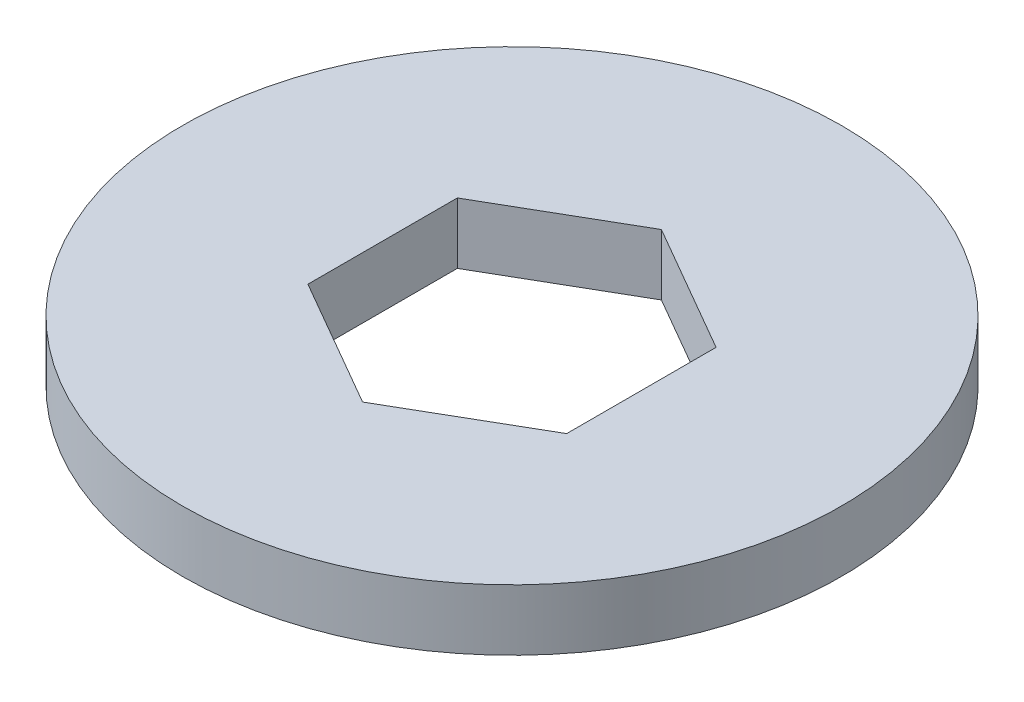
ISO-10303-21;
HEADER;
FILE_DESCRIPTION(('STEP AP214'),'2;1');
FILE_NAME('part.step','',(''),(''),'','','');
FILE_SCHEMA(('AUTOMOTIVE_DESIGN { 1 0 10303 214 1 1 1 1 }'));
ENDSEC;
DATA;
#1=APPLICATION_CONTEXT('core data for automotive mechanical design processes');
#2=APPLICATION_PROTOCOL_DEFINITION('international standard','automotive_design',2000,#1);
#3=PRODUCT_CONTEXT('',#1,'mechanical');
#4=PRODUCT('Part','Part','',(#3));
#5=PRODUCT_RELATED_PRODUCT_CATEGORY('part','',(#4));
#6=PRODUCT_DEFINITION_FORMATION('','',#4);
#7=PRODUCT_DEFINITION_CONTEXT('part definition',#1,'design');
#8=PRODUCT_DEFINITION('design','',#6,#7);
#9=PRODUCT_DEFINITION_SHAPE('','',#8);
#10=(LENGTH_UNIT() NAMED_UNIT(*) SI_UNIT(.MILLI.,.METRE.));
#11=(NAMED_UNIT(*) PLANE_ANGLE_UNIT() SI_UNIT($,.RADIAN.));
#12=(NAMED_UNIT(*) SI_UNIT($,.STERADIAN.) SOLID_ANGLE_UNIT());
#13=UNCERTAINTY_MEASURE_WITH_UNIT(LENGTH_MEASURE(1.E-05),#10,'distance_accuracy_value','');
#14=(GEOMETRIC_REPRESENTATION_CONTEXT(3) GLOBAL_UNCERTAINTY_ASSIGNED_CONTEXT((#13)) GLOBAL_UNIT_ASSIGNED_CONTEXT((#10,
#11,#12)) REPRESENTATION_CONTEXT('',''));
#15=CARTESIAN_POINT('',(0.,0.,0.));
#16=DIRECTION('',(0.,0.,1.));
#17=DIRECTION('',(1.,0.,0.));
#18=AXIS2_PLACEMENT_3D('',#15,#16,#17);
#19=CARTESIAN_POINT('',(0.,2.5,0.));
#20=DIRECTION('',(0.,1.,0.));
#21=DIRECTION('',(0.,0.,1.));
#22=AXIS2_PLACEMENT_3D('',#19,#20,#21);
#23=PLANE('',#22);
#24=CARTESIAN_POINT('',(0.,2.5,0.));
#25=DIRECTION('',(0.,1.,0.));
#26=DIRECTION('',(0.,0.,1.));
#27=AXIS2_PLACEMENT_3D('',#24,#25,#26);
#28=CIRCLE('',#27,13.5);
#29=CARTESIAN_POINT('',(0.,2.5,-13.5));
#30=VERTEX_POINT('',#29);
#31=EDGE_CURVE('E11',#30,#30,#28,.T.);
#32=ORIENTED_EDGE('',*,*,#31,.T.);
#33=EDGE_LOOP('',(#32));
#34=FACE_BOUND('',#33,.T.);
#35=DIRECTION('',(0.866025403784438,0.,-0.500000000000001));
#36=VECTOR('',#35,1.);
#37=CARTESIAN_POINT('',(0.,2.5,6.11991285341004));
#38=LINE('',#37,#36);
#39=CARTESIAN_POINT('',(0.,2.5,6.11991285341004));
#40=VERTEX_POINT('',#39);
#41=CARTESIAN_POINT('',(5.30000000000001,2.5,3.05995642670501));
#42=VERTEX_POINT('',#41);
#43=EDGE_CURVE('E102',#40,#42,#38,.T.);
#44=ORIENTED_EDGE('',*,*,#43,.F.);
#45=DIRECTION('',(0.866025403784442,0.,0.499999999999995));
#46=VECTOR('',#45,1.);
#47=CARTESIAN_POINT('',(-5.29999999999997,2.5,3.05995642670508));
#48=LINE('',#47,#46);
#49=CARTESIAN_POINT('',(-5.29999999999997,2.5,3.05995642670508));
#50=VERTEX_POINT('',#49);
#51=EDGE_CURVE('E94',#50,#40,#48,.T.);
#52=ORIENTED_EDGE('',*,*,#51,.F.);
#53=DIRECTION('',(0.,0.,1.));
#54=VECTOR('',#53,1.);
#55=CARTESIAN_POINT('',(-5.30000000000003,2.5,-3.05995642670497));
#56=LINE('',#55,#54);
#57=CARTESIAN_POINT('',(-5.30000000000003,2.5,-3.05995642670497));
#58=VERTEX_POINT('',#57);
#59=EDGE_CURVE('E122',#58,#50,#56,.T.);
#60=ORIENTED_EDGE('',*,*,#59,.F.);
#61=DIRECTION('',(-0.866025403784435,0.,0.500000000000007));
#62=VECTOR('',#61,1.);
#63=CARTESIAN_POINT('',(0.,2.5,-6.11991285341004));
#64=LINE('',#63,#62);
#65=CARTESIAN_POINT('',(0.,2.5,-6.11991285341004));
#66=VERTEX_POINT('',#65);
#67=EDGE_CURVE('E120',#66,#58,#64,.T.);
#68=ORIENTED_EDGE('',*,*,#67,.F.);
#69=DIRECTION('',(-0.866025403784441,0.,-0.499999999999995));
#70=VECTOR('',#69,1.);
#71=CARTESIAN_POINT('',(5.29999999999999,2.5,-3.05995642670504));
#72=LINE('',#71,#70);
#73=CARTESIAN_POINT('',(5.29999999999999,2.5,-3.05995642670504));
#74=VERTEX_POINT('',#73);
#75=EDGE_CURVE('E116',#74,#66,#72,.T.);
#76=ORIENTED_EDGE('',*,*,#75,.F.);
#77=DIRECTION('',(0.,0.,-1.));
#78=VECTOR('',#77,1.);
#79=CARTESIAN_POINT('',(5.30000000000001,2.5,3.05995642670501));
#80=LINE('',#79,#78);
#81=EDGE_CURVE('E114',#42,#74,#80,.T.);
#82=ORIENTED_EDGE('',*,*,#81,.F.);
#83=EDGE_LOOP('',(#44,#52,#60,#68,#76,#82));
#84=FACE_BOUND('',#83,.T.);
#85=ADVANCED_FACE('F41',(#34,#84),#23,.T.);
#86=CARTESIAN_POINT('',(0.,0.,0.));
#87=DIRECTION('',(0.,1.,0.));
#88=DIRECTION('',(0.,0.,1.));
#89=AXIS2_PLACEMENT_3D('',#86,#87,#88);
#90=PLANE('',#89);
#91=CARTESIAN_POINT('',(0.,0.,0.));
#92=DIRECTION('',(0.,1.,0.));
#93=DIRECTION('',(0.,0.,1.));
#94=AXIS2_PLACEMENT_3D('',#91,#92,#93);
#95=CIRCLE('',#94,13.5);
#96=CARTESIAN_POINT('',(0.,0.,-13.5));
#97=VERTEX_POINT('',#96);
#98=EDGE_CURVE('E45',#97,#97,#95,.T.);
#99=ORIENTED_EDGE('',*,*,#98,.F.);
#100=EDGE_LOOP('',(#99));
#101=FACE_BOUND('',#100,.T.);
#102=DIRECTION('',(0.866025403784442,0.,0.499999999999995));
#103=VECTOR('',#102,1.);
#104=CARTESIAN_POINT('',(-5.29999999999997,0.,3.05995642670508));
#105=LINE('',#104,#103);
#106=CARTESIAN_POINT('',(-5.29999999999997,0.,3.05995642670508));
#107=VERTEX_POINT('',#106);
#108=CARTESIAN_POINT('',(0.,0.,6.11991285341004));
#109=VERTEX_POINT('',#108);
#110=EDGE_CURVE('E64',#107,#109,#105,.T.);
#111=ORIENTED_EDGE('',*,*,#110,.T.);
#112=DIRECTION('',(0.866025403784438,0.,-0.500000000000001));
#113=VECTOR('',#112,1.);
#114=CARTESIAN_POINT('',(0.,0.,6.11991285341004));
#115=LINE('',#114,#113);
#116=CARTESIAN_POINT('',(5.30000000000001,0.,3.05995642670501));
#117=VERTEX_POINT('',#116);
#118=EDGE_CURVE('E109',#109,#117,#115,.T.);
#119=ORIENTED_EDGE('',*,*,#118,.T.);
#120=DIRECTION('',(0.,0.,-1.));
#121=VECTOR('',#120,1.);
#122=CARTESIAN_POINT('',(5.30000000000001,0.,3.05995642670501));
#123=LINE('',#122,#121);
#124=CARTESIAN_POINT('',(5.29999999999999,0.,-3.05995642670504));
#125=VERTEX_POINT('',#124);
#126=EDGE_CURVE('E126',#117,#125,#123,.T.);
#127=ORIENTED_EDGE('',*,*,#126,.T.);
#128=DIRECTION('',(-0.866025403784441,0.,-0.499999999999995));
#129=VECTOR('',#128,1.);
#130=CARTESIAN_POINT('',(5.29999999999999,0.,-3.05995642670504));
#131=LINE('',#130,#129);
#132=CARTESIAN_POINT('',(0.,0.,-6.11991285341004));
#133=VERTEX_POINT('',#132);
#134=EDGE_CURVE('E129',#125,#133,#131,.T.);
#135=ORIENTED_EDGE('',*,*,#134,.T.);
#136=DIRECTION('',(-0.866025403784435,0.,0.500000000000007));
#137=VECTOR('',#136,1.);
#138=CARTESIAN_POINT('',(0.,0.,-6.11991285341004));
#139=LINE('',#138,#137);
#140=CARTESIAN_POINT('',(-5.30000000000003,0.,-3.05995642670497));
#141=VERTEX_POINT('',#140);
#142=EDGE_CURVE('E132',#133,#141,#139,.T.);
#143=ORIENTED_EDGE('',*,*,#142,.T.);
#144=DIRECTION('',(0.,0.,1.));
#145=VECTOR('',#144,1.);
#146=CARTESIAN_POINT('',(-5.30000000000003,0.,-3.05995642670497));
#147=LINE('',#146,#145);
#148=EDGE_CURVE('E103',#141,#107,#147,.T.);
#149=ORIENTED_EDGE('',*,*,#148,.T.);
#150=EDGE_LOOP('',(#111,#119,#127,#135,#143,#149));
#151=FACE_BOUND('',#150,.T.);
#152=ADVANCED_FACE('F149',(#101,#151),#90,.F.);
#153=CARTESIAN_POINT('',(0.,2.5,0.));
#154=DIRECTION('',(0.,-1.,0.));
#155=DIRECTION('',(0.,0.,-1.));
#156=AXIS2_PLACEMENT_3D('',#153,#154,#155);
#157=CYLINDRICAL_SURFACE('',#156,13.5);
#158=CARTESIAN_POINT('',(0.,2.5,-13.5));
#159=CARTESIAN_POINT('',(0.,2.47395833333333,-13.5));
#160=CARTESIAN_POINT('',(0.,2.44791666666667,-13.5));
#161=CARTESIAN_POINT('',(0.,2.39583333333333,-13.5));
#162=CARTESIAN_POINT('',(0.,2.36979166666667,-13.5));
#163=CARTESIAN_POINT('',(0.,2.31770833333333,-13.5));
#164=CARTESIAN_POINT('',(0.,2.29166666666667,-13.5));
#165=CARTESIAN_POINT('',(0.,2.23958333333333,-13.5));
#166=CARTESIAN_POINT('',(0.,2.21354166666667,-13.5));
#167=CARTESIAN_POINT('',(0.,2.16145833333333,-13.5));
#168=CARTESIAN_POINT('',(0.,2.13541666666667,-13.5));
#169=CARTESIAN_POINT('',(0.,2.08333333333333,-13.5));
#170=CARTESIAN_POINT('',(0.,2.05729166666667,-13.5));
#171=CARTESIAN_POINT('',(0.,2.00520833333333,-13.5));
#172=CARTESIAN_POINT('',(0.,1.97916666666667,-13.5));
#173=CARTESIAN_POINT('',(0.,1.92708333333333,-13.5));
#174=CARTESIAN_POINT('',(0.,1.90104166666667,-13.5));
#175=CARTESIAN_POINT('',(0.,1.84895833333333,-13.5));
#176=CARTESIAN_POINT('',(0.,1.82291666666667,-13.5));
#177=CARTESIAN_POINT('',(0.,1.77083333333333,-13.5));
#178=CARTESIAN_POINT('',(0.,1.74479166666667,-13.5));
#179=CARTESIAN_POINT('',(0.,1.69270833333333,-13.5));
#180=CARTESIAN_POINT('',(0.,1.66666666666667,-13.5));
#181=CARTESIAN_POINT('',(0.,1.61458333333333,-13.5));
#182=CARTESIAN_POINT('',(0.,1.58854166666667,-13.5));
#183=CARTESIAN_POINT('',(0.,1.53645833333333,-13.5));
#184=CARTESIAN_POINT('',(0.,1.51041666666667,-13.5));
#185=CARTESIAN_POINT('',(0.,1.45833333333333,-13.5));
#186=CARTESIAN_POINT('',(0.,1.43229166666667,-13.5));
#187=CARTESIAN_POINT('',(0.,1.38020833333333,-13.5));
#188=CARTESIAN_POINT('',(0.,1.35416666666667,-13.5));
#189=CARTESIAN_POINT('',(0.,1.30208333333333,-13.5));
#190=CARTESIAN_POINT('',(0.,1.27604166666667,-13.5));
#191=CARTESIAN_POINT('',(0.,1.22395833333333,-13.5));
#192=CARTESIAN_POINT('',(0.,1.19791666666667,-13.5));
#193=CARTESIAN_POINT('',(0.,1.14583333333333,-13.5));
#194=CARTESIAN_POINT('',(0.,1.11979166666667,-13.5));
#195=CARTESIAN_POINT('',(0.,1.06770833333333,-13.5));
#196=CARTESIAN_POINT('',(0.,1.04166666666667,-13.5));
#197=CARTESIAN_POINT('',(0.,0.989583333333333,-13.5));
#198=CARTESIAN_POINT('',(0.,0.963541666666667,-13.5));
#199=CARTESIAN_POINT('',(0.,0.911458333333333,-13.5));
#200=CARTESIAN_POINT('',(0.,0.885416666666667,-13.5));
#201=CARTESIAN_POINT('',(0.,0.833333333333333,-13.5));
#202=CARTESIAN_POINT('',(0.,0.807291666666667,-13.5));
#203=CARTESIAN_POINT('',(0.,0.755208333333333,-13.5));
#204=CARTESIAN_POINT('',(0.,0.729166666666667,-13.5));
#205=CARTESIAN_POINT('',(0.,0.677083333333333,-13.5));
#206=CARTESIAN_POINT('',(0.,0.651041666666667,-13.5));
#207=CARTESIAN_POINT('',(0.,0.598958333333333,-13.5));
#208=CARTESIAN_POINT('',(0.,0.572916666666667,-13.5));
#209=CARTESIAN_POINT('',(0.,0.520833333333334,-13.5));
#210=CARTESIAN_POINT('',(0.,0.494791666666667,-13.5));
#211=CARTESIAN_POINT('',(0.,0.442708333333334,-13.5));
#212=CARTESIAN_POINT('',(0.,0.416666666666667,-13.5));
#213=CARTESIAN_POINT('',(0.,0.364583333333334,-13.5));
#214=CARTESIAN_POINT('',(0.,0.338541666666667,-13.5));
#215=CARTESIAN_POINT('',(0.,0.286458333333334,-13.5));
#216=CARTESIAN_POINT('',(0.,0.260416666666667,-13.5));
#217=CARTESIAN_POINT('',(0.,0.208333333333334,-13.5));
#218=CARTESIAN_POINT('',(0.,0.182291666666667,-13.5));
#219=CARTESIAN_POINT('',(0.,0.130208333333333,-13.5));
#220=CARTESIAN_POINT('',(0.,0.104166666666667,-13.5));
#221=CARTESIAN_POINT('',(0.,0.0520833333333334,-13.5));
#222=CARTESIAN_POINT('',(0.,0.0260416666666667,-13.5));
#223=CARTESIAN_POINT('',(0.,0.,-13.5));
#224=B_SPLINE_CURVE_WITH_KNOTS('',3,(#158,#159,#160,#161,#162,#163,#164,#165,#166,#167,#168,
#169,#170,#171,#172,#173,#174,#175,#176,#177,#178,#179,#180,#181,#182,#183,#184,#185,#186,#187,
#188,#189,#190,#191,#192,#193,#194,#195,#196,#197,#198,#199,#200,#201,#202,#203,#204,#205,#206,
#207,#208,#209,#210,#211,#212,#213,#214,#215,#216,#217,#218,#219,#220,#221,#222,#223),
.UNSPECIFIED.,.F.,.F.,(4,2,2,2,2,2,2,2,2,2,2,2,2,2,2,2,2,2,2,2,2,2,2,2,2,2,2,2,2,2,2,2,4),(0.,
0.0781250000000001,0.15625,0.234375,0.3125,0.390625,0.46875,0.546875,0.625000000000001,
0.703125000000001,0.781250000000001,0.859375000000001,0.937500000000001,1.015625,1.09375,
1.171875,1.25,1.328125,1.40625,1.484375,1.5625,1.640625,1.71875,1.796875,1.875,1.953125,2.03125,
2.109375,2.1875,2.265625,2.34375,2.421875,2.5),.UNSPECIFIED.);
#225=EDGE_CURVE('BSEAM43',#30,#97,#224,.T.);
#226=ORIENTED_EDGE('',*,*,#31,.F.);
#227=ORIENTED_EDGE('',*,*,#98,.T.);
#228=ORIENTED_EDGE('',*,*,#225,.T.);
#229=ORIENTED_EDGE('',*,*,#225,.F.);
#230=EDGE_LOOP('',(#226,#228,#227,#229));
#231=FACE_BOUND('',#230,.T.);
#232=ADVANCED_FACE('F43',(#231),#157,.T.);
#233=CARTESIAN_POINT('',(-5.29999999999997,2.5,3.05995642670508));
#234=DIRECTION('',(0.499999999999995,0.,-0.866025403784441));
#235=DIRECTION('',(-0.866025403784442,0.,-0.499999999999995));
#236=AXIS2_PLACEMENT_3D('',#233,#234,#235);
#237=PLANE('',#236);
#238=ORIENTED_EDGE('',*,*,#110,.F.);
#239=DIRECTION('',(0.,-1.,0.));
#240=VECTOR('',#239,1.);
#241=CARTESIAN_POINT('',(-5.29999999999997,2.5,3.05995642670508));
#242=LINE('',#241,#240);
#243=EDGE_CURVE('E98',#50,#107,#242,.T.);
#244=ORIENTED_EDGE('',*,*,#243,.F.);
#245=ORIENTED_EDGE('',*,*,#51,.T.);
#246=DIRECTION('',(0.,-1.,0.));
#247=VECTOR('',#246,1.);
#248=CARTESIAN_POINT('',(0.,2.5,6.11991285341004));
#249=LINE('',#248,#247);
#250=EDGE_CURVE('E97',#40,#109,#249,.T.);
#251=ORIENTED_EDGE('',*,*,#250,.T.);
#252=EDGE_LOOP('',(#238,#244,#245,#251));
#253=FACE_BOUND('',#252,.T.);
#254=ADVANCED_FACE('F96',(#253),#237,.T.);
#255=CARTESIAN_POINT('',(0.,2.5,6.11991285341004));
#256=DIRECTION('',(-0.500000000000001,0.,-0.866025403784438));
#257=DIRECTION('',(-0.866025403784438,0.,0.500000000000001));
#258=AXIS2_PLACEMENT_3D('',#255,#256,#257);
#259=PLANE('',#258);
#260=ORIENTED_EDGE('',*,*,#118,.F.);
#261=ORIENTED_EDGE('',*,*,#250,.F.);
#262=ORIENTED_EDGE('',*,*,#43,.T.);
#263=DIRECTION('',(0.,-1.,0.));
#264=VECTOR('',#263,1.);
#265=CARTESIAN_POINT('',(5.30000000000001,2.5,3.05995642670501));
#266=LINE('',#265,#264);
#267=EDGE_CURVE('E110',#42,#117,#266,.T.);
#268=ORIENTED_EDGE('',*,*,#267,.T.);
#269=EDGE_LOOP('',(#260,#261,#262,#268));
#270=FACE_BOUND('',#269,.T.);
#271=ADVANCED_FACE('F106',(#270),#259,.T.);
#272=CARTESIAN_POINT('',(5.30000000000001,2.5,3.05995642670501));
#273=DIRECTION('',(-1.,0.,0.));
#274=DIRECTION('',(0.,0.,1.));
#275=AXIS2_PLACEMENT_3D('',#272,#273,#274);
#276=PLANE('',#275);
#277=ORIENTED_EDGE('',*,*,#126,.F.);
#278=ORIENTED_EDGE('',*,*,#267,.F.);
#279=ORIENTED_EDGE('',*,*,#81,.T.);
#280=DIRECTION('',(0.,-1.,0.));
#281=VECTOR('',#280,1.);
#282=CARTESIAN_POINT('',(5.29999999999999,2.5,-3.05995642670504));
#283=LINE('',#282,#281);
#284=EDGE_CURVE('E141',#74,#125,#283,.T.);
#285=ORIENTED_EDGE('',*,*,#284,.T.);
#286=EDGE_LOOP('',(#277,#278,#279,#285));
#287=FACE_BOUND('',#286,.T.);
#288=ADVANCED_FACE('F145',(#287),#276,.T.);
#289=CARTESIAN_POINT('',(5.29999999999999,2.5,-3.05995642670504));
#290=DIRECTION('',(-0.499999999999995,0.,0.866025403784442));
#291=DIRECTION('',(0.866025403784442,0.,0.499999999999995));
#292=AXIS2_PLACEMENT_3D('',#289,#290,#291);
#293=PLANE('',#292);
#294=ORIENTED_EDGE('',*,*,#134,.F.);
#295=ORIENTED_EDGE('',*,*,#284,.F.);
#296=ORIENTED_EDGE('',*,*,#75,.T.);
#297=DIRECTION('',(0.,-1.,0.));
#298=VECTOR('',#297,1.);
#299=CARTESIAN_POINT('',(0.,2.5,-6.11991285341004));
#300=LINE('',#299,#298);
#301=EDGE_CURVE('E139',#66,#133,#300,.T.);
#302=ORIENTED_EDGE('',*,*,#301,.T.);
#303=EDGE_LOOP('',(#294,#295,#296,#302));
#304=FACE_BOUND('',#303,.T.);
#305=ADVANCED_FACE('F157',(#304),#293,.T.);
#306=CARTESIAN_POINT('',(0.,2.5,-6.11991285341004));
#307=DIRECTION('',(0.500000000000007,0.,0.866025403784434));
#308=DIRECTION('',(0.866025403784435,0.,-0.500000000000007));
#309=AXIS2_PLACEMENT_3D('',#306,#307,#308);
#310=PLANE('',#309);
#311=ORIENTED_EDGE('',*,*,#142,.F.);
#312=ORIENTED_EDGE('',*,*,#301,.F.);
#313=ORIENTED_EDGE('',*,*,#67,.T.);
#314=DIRECTION('',(0.,-1.,0.));
#315=VECTOR('',#314,1.);
#316=CARTESIAN_POINT('',(-5.30000000000003,2.5,-3.05995642670497));
#317=LINE('',#316,#315);
#318=EDGE_CURVE('E56',#58,#141,#317,.T.);
#319=ORIENTED_EDGE('',*,*,#318,.T.);
#320=EDGE_LOOP('',(#311,#312,#313,#319));
#321=FACE_BOUND('',#320,.T.);
#322=ADVANCED_FACE('F155',(#321),#310,.T.);
#323=CARTESIAN_POINT('',(-5.30000000000003,2.5,-3.05995642670497));
#324=DIRECTION('',(1.,0.,0.));
#325=DIRECTION('',(0.,0.,-1.));
#326=AXIS2_PLACEMENT_3D('',#323,#324,#325);
#327=PLANE('',#326);
#328=ORIENTED_EDGE('',*,*,#148,.F.);
#329=ORIENTED_EDGE('',*,*,#318,.F.);
#330=ORIENTED_EDGE('',*,*,#59,.T.);
#331=ORIENTED_EDGE('',*,*,#243,.T.);
#332=EDGE_LOOP('',(#328,#329,#330,#331));
#333=FACE_BOUND('',#332,.T.);
#334=ADVANCED_FACE('F151',(#333),#327,.T.);
#335=CLOSED_SHELL('',(#85,#152,#232,#254,#271,#288,#305,#322,#334));
#336=MANIFOLD_SOLID_BREP('B2',#335);
#337=ADVANCED_BREP_SHAPE_REPRESENTATION('',(#18,#336),#14);
#338=SHAPE_DEFINITION_REPRESENTATION(#9,#337);
ENDSEC;
END-ISO-10303-21;
